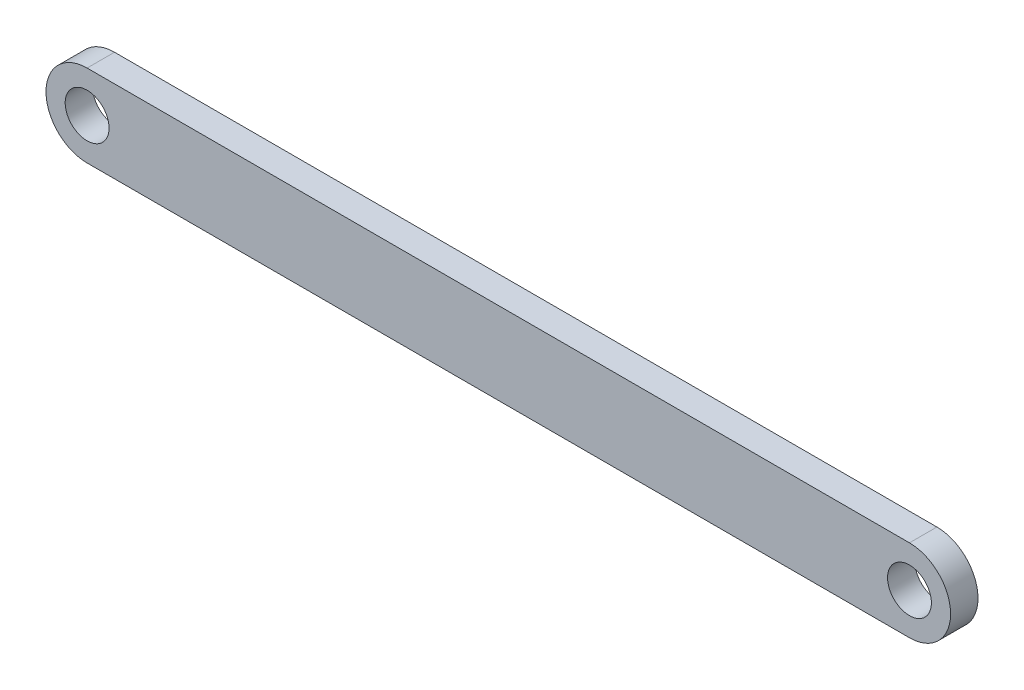
ISO-10303-21;
HEADER;
FILE_DESCRIPTION(('STEP AP214'),'2;1');
FILE_NAME('part.step','',(''),(''),'','','');
FILE_SCHEMA(('AUTOMOTIVE_DESIGN { 1 0 10303 214 1 1 1 1 }'));
ENDSEC;
DATA;
#1=APPLICATION_CONTEXT('core data for automotive mechanical design processes');
#2=APPLICATION_PROTOCOL_DEFINITION('international standard','automotive_design',2000,#1);
#3=PRODUCT_CONTEXT('',#1,'mechanical');
#4=PRODUCT('Part','Part','',(#3));
#5=PRODUCT_RELATED_PRODUCT_CATEGORY('part','',(#4));
#6=PRODUCT_DEFINITION_FORMATION('','',#4);
#7=PRODUCT_DEFINITION_CONTEXT('part definition',#1,'design');
#8=PRODUCT_DEFINITION('design','',#6,#7);
#9=PRODUCT_DEFINITION_SHAPE('','',#8);
#10=(LENGTH_UNIT() NAMED_UNIT(*) SI_UNIT(.MILLI.,.METRE.));
#11=(NAMED_UNIT(*) PLANE_ANGLE_UNIT() SI_UNIT($,.RADIAN.));
#12=(NAMED_UNIT(*) SI_UNIT($,.STERADIAN.) SOLID_ANGLE_UNIT());
#13=UNCERTAINTY_MEASURE_WITH_UNIT(LENGTH_MEASURE(1.E-05),#10,'distance_accuracy_value','');
#14=(GEOMETRIC_REPRESENTATION_CONTEXT(3) GLOBAL_UNCERTAINTY_ASSIGNED_CONTEXT((#13)) GLOBAL_UNIT_ASSIGNED_CONTEXT((#10,
#11,#12)) REPRESENTATION_CONTEXT('',''));
#15=CARTESIAN_POINT('',(0.,0.,0.));
#16=DIRECTION('',(0.,0.,1.));
#17=DIRECTION('',(1.,0.,0.));
#18=AXIS2_PLACEMENT_3D('',#15,#16,#17);
#19=CARTESIAN_POINT('',(-75.,0.,2.5));
#20=DIRECTION('',(0.,0.,1.));
#21=DIRECTION('',(1.,0.,0.));
#22=AXIS2_PLACEMENT_3D('',#19,#20,#21);
#23=PLANE('',#22);
#24=CARTESIAN_POINT('',(-75.,0.,2.5));
#25=DIRECTION('',(0.,0.,1.));
#26=DIRECTION('',(1.,0.,0.));
#27=AXIS2_PLACEMENT_3D('',#24,#25,#26);
#28=CIRCLE('',#27,4.00000000000001);
#29=CARTESIAN_POINT('',(-71.,0.,2.5));
#30=VERTEX_POINT('',#29);
#31=EDGE_CURVE('E116',#30,#30,#28,.T.);
#32=ORIENTED_EDGE('',*,*,#31,.F.);
#33=EDGE_LOOP('',(#32));
#34=FACE_BOUND('',#33,.T.);
#35=CARTESIAN_POINT('',(-75.,0.,2.5));
#36=DIRECTION('',(0.,0.,1.));
#37=DIRECTION('',(1.,0.,0.));
#38=AXIS2_PLACEMENT_3D('',#35,#36,#37);
#39=CIRCLE('',#38,7.5);
#40=CARTESIAN_POINT('',(-75.,7.5,2.5));
#41=VERTEX_POINT('',#40);
#42=CARTESIAN_POINT('',(-75.,-7.5,2.5));
#43=VERTEX_POINT('',#42);
#44=EDGE_CURVE('E96',#41,#43,#39,.T.);
#45=ORIENTED_EDGE('',*,*,#44,.T.);
#46=DIRECTION('',(1.,0.,0.));
#47=VECTOR('',#46,1.);
#48=CARTESIAN_POINT('',(-75.,-7.5,2.5));
#49=LINE('',#48,#47);
#50=CARTESIAN_POINT('',(75.,-7.49999999999997,2.5));
#51=VERTEX_POINT('',#50);
#52=EDGE_CURVE('E91',#43,#51,#49,.T.);
#53=ORIENTED_EDGE('',*,*,#52,.T.);
#54=CARTESIAN_POINT('',(75.,0.,2.5));
#55=DIRECTION('',(0.,0.,1.));
#56=DIRECTION('',(1.,0.,0.));
#57=AXIS2_PLACEMENT_3D('',#54,#55,#56);
#58=CIRCLE('',#57,7.5);
#59=CARTESIAN_POINT('',(75.,7.50000000000003,2.5));
#60=VERTEX_POINT('',#59);
#61=EDGE_CURVE('E94',#51,#60,#58,.T.);
#62=ORIENTED_EDGE('',*,*,#61,.T.);
#63=DIRECTION('',(-1.,0.,0.));
#64=VECTOR('',#63,1.);
#65=CARTESIAN_POINT('',(-75.,7.5,2.5));
#66=LINE('',#65,#64);
#67=EDGE_CURVE('E61',#60,#41,#66,.T.);
#68=ORIENTED_EDGE('',*,*,#67,.T.);
#69=EDGE_LOOP('',(#45,#53,#62,#68));
#70=FACE_BOUND('',#69,.T.);
#71=CARTESIAN_POINT('',(75.,0.,2.5));
#72=DIRECTION('',(0.,0.,1.));
#73=DIRECTION('',(1.,0.,0.));
#74=AXIS2_PLACEMENT_3D('',#71,#72,#73);
#75=CIRCLE('',#74,4.00000000000001);
#76=CARTESIAN_POINT('',(79.,0.,2.5));
#77=VERTEX_POINT('',#76);
#78=EDGE_CURVE('E138',#77,#77,#75,.T.);
#79=ORIENTED_EDGE('',*,*,#78,.F.);
#80=EDGE_LOOP('',(#79));
#81=FACE_BOUND('',#80,.T.);
#82=ADVANCED_FACE('F43',(#34,#70,#81),#23,.T.);
#83=CARTESIAN_POINT('',(-75.,0.,-2.5));
#84=DIRECTION('',(0.,0.,1.));
#85=DIRECTION('',(1.,0.,0.));
#86=AXIS2_PLACEMENT_3D('',#83,#84,#85);
#87=PLANE('',#86);
#88=CARTESIAN_POINT('',(-75.,0.,-2.5));
#89=DIRECTION('',(0.,0.,1.));
#90=DIRECTION('',(1.,0.,0.));
#91=AXIS2_PLACEMENT_3D('',#88,#89,#90);
#92=CIRCLE('',#91,7.5);
#93=CARTESIAN_POINT('',(-75.,7.5,-2.5));
#94=VERTEX_POINT('',#93);
#95=CARTESIAN_POINT('',(-75.,-7.5,-2.5));
#96=VERTEX_POINT('',#95);
#97=EDGE_CURVE('E112',#94,#96,#92,.T.);
#98=ORIENTED_EDGE('',*,*,#97,.F.);
#99=DIRECTION('',(-1.,0.,0.));
#100=VECTOR('',#99,1.);
#101=CARTESIAN_POINT('',(-75.,7.5,-2.5));
#102=LINE('',#101,#100);
#103=CARTESIAN_POINT('',(75.,7.50000000000003,-2.5));
#104=VERTEX_POINT('',#103);
#105=EDGE_CURVE('E84',#104,#94,#102,.T.);
#106=ORIENTED_EDGE('',*,*,#105,.F.);
#107=CARTESIAN_POINT('',(75.,0.,-2.5));
#108=DIRECTION('',(0.,0.,1.));
#109=DIRECTION('',(1.,0.,0.));
#110=AXIS2_PLACEMENT_3D('',#107,#108,#109);
#111=CIRCLE('',#110,7.5);
#112=CARTESIAN_POINT('',(75.,-7.49999999999997,-2.5));
#113=VERTEX_POINT('',#112);
#114=EDGE_CURVE('E78',#113,#104,#111,.T.);
#115=ORIENTED_EDGE('',*,*,#114,.F.);
#116=DIRECTION('',(1.,0.,0.));
#117=VECTOR('',#116,1.);
#118=CARTESIAN_POINT('',(-75.,-7.5,-2.5));
#119=LINE('',#118,#117);
#120=EDGE_CURVE('E101',#96,#113,#119,.T.);
#121=ORIENTED_EDGE('',*,*,#120,.F.);
#122=EDGE_LOOP('',(#98,#106,#115,#121));
#123=FACE_BOUND('',#122,.T.);
#124=CARTESIAN_POINT('',(-75.,0.,-2.5));
#125=DIRECTION('',(0.,0.,1.));
#126=DIRECTION('',(1.,0.,0.));
#127=AXIS2_PLACEMENT_3D('',#124,#125,#126);
#128=CIRCLE('',#127,4.00000000000001);
#129=CARTESIAN_POINT('',(-71.,0.,-2.5));
#130=VERTEX_POINT('',#129);
#131=EDGE_CURVE('E134',#130,#130,#128,.T.);
#132=ORIENTED_EDGE('',*,*,#131,.T.);
#133=EDGE_LOOP('',(#132));
#134=FACE_BOUND('',#133,.T.);
#135=CARTESIAN_POINT('',(75.,0.,-2.5));
#136=DIRECTION('',(0.,0.,1.));
#137=DIRECTION('',(1.,0.,0.));
#138=AXIS2_PLACEMENT_3D('',#135,#136,#137);
#139=CIRCLE('',#138,4.00000000000001);
#140=CARTESIAN_POINT('',(79.,0.,-2.5));
#141=VERTEX_POINT('',#140);
#142=EDGE_CURVE('E142',#141,#141,#139,.T.);
#143=ORIENTED_EDGE('',*,*,#142,.T.);
#144=EDGE_LOOP('',(#143));
#145=FACE_BOUND('',#144,.T.);
#146=ADVANCED_FACE('F129',(#123,#134,#145),#87,.F.);
#147=CARTESIAN_POINT('',(-75.,0.,2.5));
#148=DIRECTION('',(0.,0.,-1.));
#149=DIRECTION('',(-1.,0.,0.));
#150=AXIS2_PLACEMENT_3D('',#147,#148,#149);
#151=CYLINDRICAL_SURFACE('',#150,7.5);
#152=ORIENTED_EDGE('',*,*,#97,.T.);
#153=DIRECTION('',(0.,0.,-1.));
#154=VECTOR('',#153,1.);
#155=CARTESIAN_POINT('',(-75.,-7.5,2.5));
#156=LINE('',#155,#154);
#157=EDGE_CURVE('E11',#43,#96,#156,.T.);
#158=ORIENTED_EDGE('',*,*,#157,.F.);
#159=ORIENTED_EDGE('',*,*,#44,.F.);
#160=DIRECTION('',(0.,0.,-1.));
#161=VECTOR('',#160,1.);
#162=CARTESIAN_POINT('',(-75.,7.5,2.5));
#163=LINE('',#162,#161);
#164=EDGE_CURVE('E108',#41,#94,#163,.T.);
#165=ORIENTED_EDGE('',*,*,#164,.T.);
#166=EDGE_LOOP('',(#152,#158,#159,#165));
#167=FACE_BOUND('',#166,.T.);
#168=ADVANCED_FACE('F45',(#167),#151,.T.);
#169=CARTESIAN_POINT('',(-75.,-7.5,2.5));
#170=DIRECTION('',(0.,1.,0.));
#171=DIRECTION('',(-1.,0.,0.));
#172=AXIS2_PLACEMENT_3D('',#169,#170,#171);
#173=PLANE('',#172);
#174=ORIENTED_EDGE('',*,*,#120,.T.);
#175=DIRECTION('',(0.,0.,-1.));
#176=VECTOR('',#175,1.);
#177=CARTESIAN_POINT('',(75.,-7.49999999999997,2.5));
#178=LINE('',#177,#176);
#179=EDGE_CURVE('E53',#51,#113,#178,.T.);
#180=ORIENTED_EDGE('',*,*,#179,.F.);
#181=ORIENTED_EDGE('',*,*,#52,.F.);
#182=ORIENTED_EDGE('',*,*,#157,.T.);
#183=EDGE_LOOP('',(#174,#180,#181,#182));
#184=FACE_BOUND('',#183,.T.);
#185=ADVANCED_FACE('F100',(#184),#173,.F.);
#186=CARTESIAN_POINT('',(75.,0.,2.5));
#187=DIRECTION('',(0.,0.,-1.));
#188=DIRECTION('',(-1.,0.,0.));
#189=AXIS2_PLACEMENT_3D('',#186,#187,#188);
#190=CYLINDRICAL_SURFACE('',#189,7.5);
#191=ORIENTED_EDGE('',*,*,#114,.T.);
#192=DIRECTION('',(0.,0.,-1.));
#193=VECTOR('',#192,1.);
#194=CARTESIAN_POINT('',(75.,7.50000000000003,2.5));
#195=LINE('',#194,#193);
#196=EDGE_CURVE('E103',#60,#104,#195,.T.);
#197=ORIENTED_EDGE('',*,*,#196,.F.);
#198=ORIENTED_EDGE('',*,*,#61,.F.);
#199=ORIENTED_EDGE('',*,*,#179,.T.);
#200=EDGE_LOOP('',(#191,#197,#198,#199));
#201=FACE_BOUND('',#200,.T.);
#202=ADVANCED_FACE('F104',(#201),#190,.T.);
#203=CARTESIAN_POINT('',(-75.,7.5,2.5));
#204=DIRECTION('',(0.,-1.,0.));
#205=DIRECTION('',(1.,0.,0.));
#206=AXIS2_PLACEMENT_3D('',#203,#204,#205);
#207=PLANE('',#206);
#208=ORIENTED_EDGE('',*,*,#105,.T.);
#209=ORIENTED_EDGE('',*,*,#164,.F.);
#210=ORIENTED_EDGE('',*,*,#67,.F.);
#211=ORIENTED_EDGE('',*,*,#196,.T.);
#212=EDGE_LOOP('',(#208,#209,#210,#211));
#213=FACE_BOUND('',#212,.T.);
#214=ADVANCED_FACE('F126',(#213),#207,.F.);
#215=CARTESIAN_POINT('',(-75.,0.,2.5));
#216=DIRECTION('',(0.,0.,-1.));
#217=DIRECTION('',(-1.,0.,0.));
#218=AXIS2_PLACEMENT_3D('',#215,#216,#217);
#219=CYLINDRICAL_SURFACE('',#218,4.00000000000001);
#220=ORIENTED_EDGE('',*,*,#31,.T.);
#221=EDGE_LOOP('',(#220));
#222=FACE_BOUND('',#221,.T.);
#223=ORIENTED_EDGE('',*,*,#131,.F.);
#224=EDGE_LOOP('',(#223));
#225=FACE_BOUND('',#224,.T.);
#226=ADVANCED_FACE('F161',(#222,#225),#219,.F.);
#227=CARTESIAN_POINT('',(75.,0.,2.5));
#228=DIRECTION('',(0.,0.,-1.));
#229=DIRECTION('',(-1.,0.,0.));
#230=AXIS2_PLACEMENT_3D('',#227,#228,#229);
#231=CYLINDRICAL_SURFACE('',#230,4.00000000000001);
#232=ORIENTED_EDGE('',*,*,#78,.T.);
#233=EDGE_LOOP('',(#232));
#234=FACE_BOUND('',#233,.T.);
#235=ORIENTED_EDGE('',*,*,#142,.F.);
#236=EDGE_LOOP('',(#235));
#237=FACE_BOUND('',#236,.T.);
#238=ADVANCED_FACE('F150',(#234,#237),#231,.F.);
#239=CLOSED_SHELL('',(#82,#146,#168,#185,#202,#214,#226,#238));
#240=MANIFOLD_SOLID_BREP('B2',#239);
#241=ADVANCED_BREP_SHAPE_REPRESENTATION('',(#18,#240),#14);
#242=SHAPE_DEFINITION_REPRESENTATION(#9,#241);
ENDSEC;
END-ISO-10303-21;
